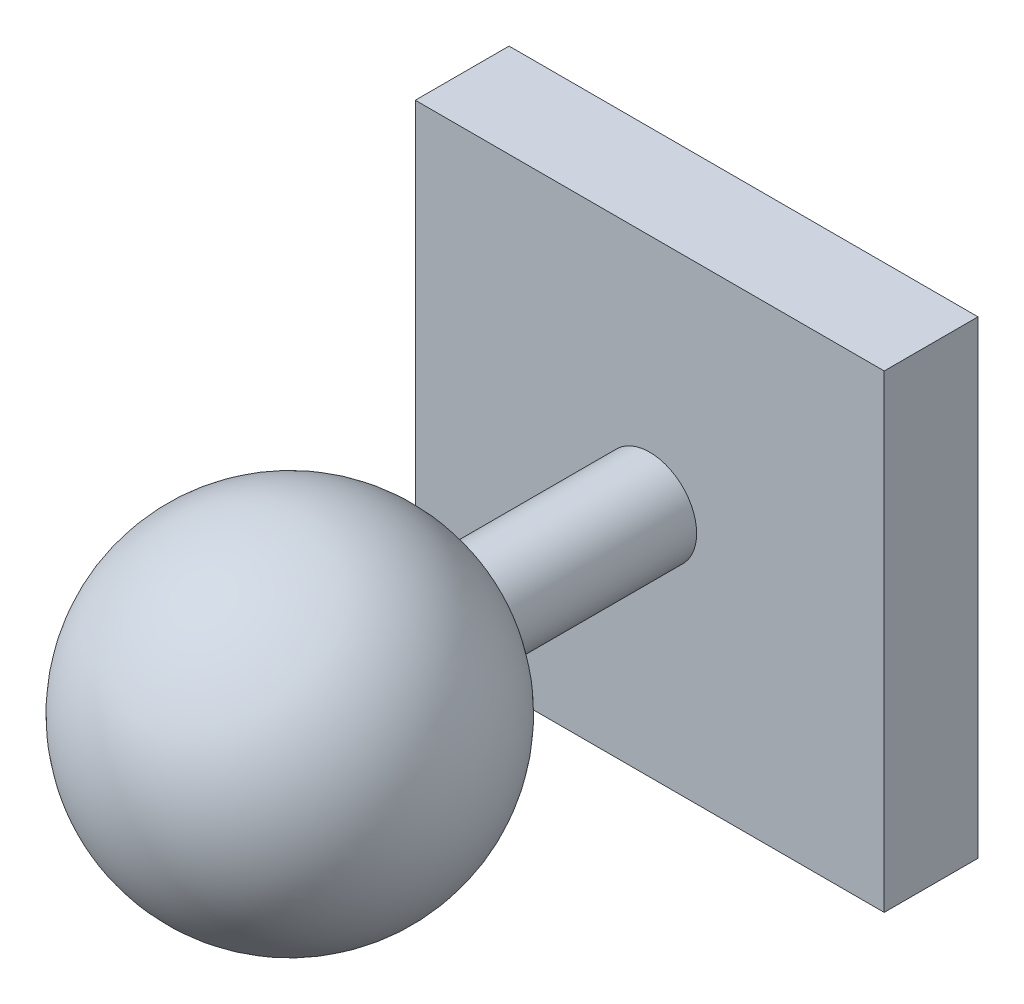
ISO-10303-21;
HEADER;
FILE_DESCRIPTION(('STEP AP214'),'2;1');
FILE_NAME('part.step','',(''),(''),'','','');
FILE_SCHEMA(('AUTOMOTIVE_DESIGN { 1 0 10303 214 1 1 1 1 }'));
ENDSEC;
DATA;
#1=APPLICATION_CONTEXT('core data for automotive mechanical design processes');
#2=APPLICATION_PROTOCOL_DEFINITION('international standard','automotive_design',2000,#1);
#3=PRODUCT_CONTEXT('',#1,'mechanical');
#4=PRODUCT('Part','Part','',(#3));
#5=PRODUCT_RELATED_PRODUCT_CATEGORY('part','',(#4));
#6=PRODUCT_DEFINITION_FORMATION('','',#4);
#7=PRODUCT_DEFINITION_CONTEXT('part definition',#1,'design');
#8=PRODUCT_DEFINITION('design','',#6,#7);
#9=PRODUCT_DEFINITION_SHAPE('','',#8);
#10=(LENGTH_UNIT() NAMED_UNIT(*) SI_UNIT(.MILLI.,.METRE.));
#11=(NAMED_UNIT(*) PLANE_ANGLE_UNIT() SI_UNIT($,.RADIAN.));
#12=(NAMED_UNIT(*) SI_UNIT($,.STERADIAN.) SOLID_ANGLE_UNIT());
#13=UNCERTAINTY_MEASURE_WITH_UNIT(LENGTH_MEASURE(1.E-05),#10,'distance_accuracy_value','');
#14=(GEOMETRIC_REPRESENTATION_CONTEXT(3) GLOBAL_UNCERTAINTY_ASSIGNED_CONTEXT((#13)) GLOBAL_UNIT_ASSIGNED_CONTEXT((#10,
#11,#12)) REPRESENTATION_CONTEXT('',''));
#15=CARTESIAN_POINT('',(0.,0.,0.));
#16=DIRECTION('',(0.,0.,1.));
#17=DIRECTION('',(1.,0.,0.));
#18=AXIS2_PLACEMENT_3D('',#15,#16,#17);
#19=CARTESIAN_POINT('',(0.,0.,48.3830677839276));
#20=DIRECTION('',(0.,0.,-1.));
#21=DIRECTION('',(-1.,0.,0.));
#22=AXIS2_PLACEMENT_3D('',#19,#20,#21);
#23=SPHERICAL_SURFACE('',#22,18.3830677839276);
#24=CARTESIAN_POINT('',(0.,0.,30.));
#25=VERTEX_POINT('',#24);
#26=VERTEX_LOOP('',#25);
#27=FACE_BOUND('',#26,.T.);
#28=ADVANCED_FACE('F38',(#27),#23,.T.);
#29=CLOSED_SHELL('',(#28));
#30=MANIFOLD_SOLID_BREP('B2',#29);
#31=CARTESIAN_POINT('',(-25.,25.,10.));
#32=DIRECTION('',(0.,0.,1.));
#33=DIRECTION('',(1.,0.,0.));
#34=AXIS2_PLACEMENT_3D('',#31,#32,#33);
#35=PLANE('',#34);
#36=DIRECTION('',(0.,-1.,0.));
#37=VECTOR('',#36,1.);
#38=CARTESIAN_POINT('',(-25.,-25.,10.));
#39=LINE('',#38,#37);
#40=CARTESIAN_POINT('',(-25.,25.,10.));
#41=VERTEX_POINT('',#40);
#42=CARTESIAN_POINT('',(-25.,-25.,10.));
#43=VERTEX_POINT('',#42);
#44=EDGE_CURVE('E102',#41,#43,#39,.T.);
#45=ORIENTED_EDGE('',*,*,#44,.T.);
#46=DIRECTION('',(1.,0.,0.));
#47=VECTOR('',#46,1.);
#48=CARTESIAN_POINT('',(25.,-25.,10.));
#49=LINE('',#48,#47);
#50=CARTESIAN_POINT('',(25.,-25.,10.));
#51=VERTEX_POINT('',#50);
#52=EDGE_CURVE('E97',#43,#51,#49,.T.);
#53=ORIENTED_EDGE('',*,*,#52,.T.);
#54=DIRECTION('',(0.,1.,0.));
#55=VECTOR('',#54,1.);
#56=CARTESIAN_POINT('',(25.,-25.,10.));
#57=LINE('',#56,#55);
#58=CARTESIAN_POINT('',(25.,25.,10.));
#59=VERTEX_POINT('',#58);
#60=EDGE_CURVE('E100',#51,#59,#57,.T.);
#61=ORIENTED_EDGE('',*,*,#60,.T.);
#62=DIRECTION('',(-1.,0.,0.));
#63=VECTOR('',#62,1.);
#64=CARTESIAN_POINT('',(25.,25.,10.));
#65=LINE('',#64,#63);
#66=EDGE_CURVE('E67',#59,#41,#65,.T.);
#67=ORIENTED_EDGE('',*,*,#66,.T.);
#68=EDGE_LOOP('',(#45,#53,#61,#67));
#69=FACE_BOUND('',#68,.T.);
#70=CARTESIAN_POINT('',(0.,0.,10.));
#71=DIRECTION('',(0.,0.,1.));
#72=DIRECTION('',(1.,0.,0.));
#73=AXIS2_PLACEMENT_3D('',#70,#71,#72);
#74=CIRCLE('',#73,5.);
#75=CARTESIAN_POINT('',(5.,0.,10.));
#76=VERTEX_POINT('',#75);
#77=EDGE_CURVE('E128',#76,#76,#74,.T.);
#78=ORIENTED_EDGE('',*,*,#77,.F.);
#79=EDGE_LOOP('',(#78));
#80=FACE_BOUND('',#79,.T.);
#81=ADVANCED_FACE('F50',(#69,#80),#35,.T.);
#82=CARTESIAN_POINT('',(-25.,-25.,10.));
#83=DIRECTION('',(1.,0.,0.));
#84=DIRECTION('',(0.,0.,-1.));
#85=AXIS2_PLACEMENT_3D('',#82,#83,#84);
#86=PLANE('',#85);
#87=DIRECTION('',(0.,-1.,0.));
#88=VECTOR('',#87,1.);
#89=CARTESIAN_POINT('',(-25.,-25.,0.));
#90=LINE('',#89,#88);
#91=CARTESIAN_POINT('',(-25.,25.,0.));
#92=VERTEX_POINT('',#91);
#93=CARTESIAN_POINT('',(-25.,-25.,0.));
#94=VERTEX_POINT('',#93);
#95=EDGE_CURVE('E114',#92,#94,#90,.T.);
#96=ORIENTED_EDGE('',*,*,#95,.T.);
#97=DIRECTION('',(0.,0.,-1.));
#98=VECTOR('',#97,1.);
#99=CARTESIAN_POINT('',(-25.,-25.,10.));
#100=LINE('',#99,#98);
#101=EDGE_CURVE('E36',#43,#94,#100,.T.);
#102=ORIENTED_EDGE('',*,*,#101,.F.);
#103=ORIENTED_EDGE('',*,*,#44,.F.);
#104=DIRECTION('',(0.,0.,-1.));
#105=VECTOR('',#104,1.);
#106=CARTESIAN_POINT('',(-25.,25.,10.));
#107=LINE('',#106,#105);
#108=EDGE_CURVE('E110',#41,#92,#107,.T.);
#109=ORIENTED_EDGE('',*,*,#108,.T.);
#110=EDGE_LOOP('',(#96,#102,#103,#109));
#111=FACE_BOUND('',#110,.T.);
#112=ADVANCED_FACE('F52',(#111),#86,.F.);
#113=CARTESIAN_POINT('',(25.,-25.,10.));
#114=DIRECTION('',(0.,1.,0.));
#115=DIRECTION('',(-1.,0.,0.));
#116=AXIS2_PLACEMENT_3D('',#113,#114,#115);
#117=PLANE('',#116);
#118=DIRECTION('',(1.,0.,0.));
#119=VECTOR('',#118,1.);
#120=CARTESIAN_POINT('',(25.,-25.,0.));
#121=LINE('',#120,#119);
#122=CARTESIAN_POINT('',(25.,-25.,0.));
#123=VERTEX_POINT('',#122);
#124=EDGE_CURVE('E106',#94,#123,#121,.T.);
#125=ORIENTED_EDGE('',*,*,#124,.T.);
#126=DIRECTION('',(0.,0.,-1.));
#127=VECTOR('',#126,1.);
#128=CARTESIAN_POINT('',(25.,-25.,10.));
#129=LINE('',#128,#127);
#130=EDGE_CURVE('E59',#51,#123,#129,.T.);
#131=ORIENTED_EDGE('',*,*,#130,.F.);
#132=ORIENTED_EDGE('',*,*,#52,.F.);
#133=ORIENTED_EDGE('',*,*,#101,.T.);
#134=EDGE_LOOP('',(#125,#131,#132,#133));
#135=FACE_BOUND('',#134,.T.);
#136=ADVANCED_FACE('F105',(#135),#117,.F.);
#137=CARTESIAN_POINT('',(25.,-25.,10.));
#138=DIRECTION('',(-1.,0.,0.));
#139=DIRECTION('',(0.,0.,1.));
#140=AXIS2_PLACEMENT_3D('',#137,#138,#139);
#141=PLANE('',#140);
#142=DIRECTION('',(0.,1.,0.));
#143=VECTOR('',#142,1.);
#144=CARTESIAN_POINT('',(25.,-25.,0.));
#145=LINE('',#144,#143);
#146=CARTESIAN_POINT('',(25.,25.,0.));
#147=VERTEX_POINT('',#146);
#148=EDGE_CURVE('E84',#123,#147,#145,.T.);
#149=ORIENTED_EDGE('',*,*,#148,.T.);
#150=DIRECTION('',(0.,0.,-1.));
#151=VECTOR('',#150,1.);
#152=CARTESIAN_POINT('',(25.,25.,10.));
#153=LINE('',#152,#151);
#154=EDGE_CURVE('E107',#59,#147,#153,.T.);
#155=ORIENTED_EDGE('',*,*,#154,.F.);
#156=ORIENTED_EDGE('',*,*,#60,.F.);
#157=ORIENTED_EDGE('',*,*,#130,.T.);
#158=EDGE_LOOP('',(#149,#155,#156,#157));
#159=FACE_BOUND('',#158,.T.);
#160=ADVANCED_FACE('F108',(#159),#141,.F.);
#161=CARTESIAN_POINT('',(25.,25.,10.));
#162=DIRECTION('',(0.,-1.,0.));
#163=DIRECTION('',(1.,0.,0.));
#164=AXIS2_PLACEMENT_3D('',#161,#162,#163);
#165=PLANE('',#164);
#166=DIRECTION('',(-1.,0.,0.));
#167=VECTOR('',#166,1.);
#168=CARTESIAN_POINT('',(25.,25.,0.));
#169=LINE('',#168,#167);
#170=EDGE_CURVE('E90',#147,#92,#169,.T.);
#171=ORIENTED_EDGE('',*,*,#170,.T.);
#172=ORIENTED_EDGE('',*,*,#108,.F.);
#173=ORIENTED_EDGE('',*,*,#66,.F.);
#174=ORIENTED_EDGE('',*,*,#154,.T.);
#175=EDGE_LOOP('',(#171,#172,#173,#174));
#176=FACE_BOUND('',#175,.T.);
#177=ADVANCED_FACE('F122',(#176),#165,.F.);
#178=CARTESIAN_POINT('',(-25.,25.,0.));
#179=DIRECTION('',(0.,0.,1.));
#180=DIRECTION('',(1.,0.,0.));
#181=AXIS2_PLACEMENT_3D('',#178,#179,#180);
#182=PLANE('',#181);
#183=CARTESIAN_POINT('',(0.,0.,0.));
#184=DIRECTION('',(0.,0.,-1.));
#185=DIRECTION('',(-1.,0.,0.));
#186=AXIS2_PLACEMENT_3D('',#183,#184,#185);
#187=CIRCLE('',#186,5.);
#188=CARTESIAN_POINT('',(-5.,0.,0.));
#189=VERTEX_POINT('',#188);
#190=EDGE_CURVE('E134',#189,#189,#187,.T.);
#191=ORIENTED_EDGE('',*,*,#190,.F.);
#192=EDGE_LOOP('',(#191));
#193=FACE_BOUND('',#192,.T.);
#194=ORIENTED_EDGE('',*,*,#95,.F.);
#195=ORIENTED_EDGE('',*,*,#170,.F.);
#196=ORIENTED_EDGE('',*,*,#148,.F.);
#197=ORIENTED_EDGE('',*,*,#124,.F.);
#198=EDGE_LOOP('',(#194,#195,#196,#197));
#199=FACE_BOUND('',#198,.T.);
#200=ADVANCED_FACE('F125',(#193,#199),#182,.F.);
#201=CARTESIAN_POINT('',(0.,0.,30.));
#202=DIRECTION('',(0.,0.,-1.));
#203=DIRECTION('',(-1.,0.,0.));
#204=AXIS2_PLACEMENT_3D('',#201,#202,#203);
#205=CYLINDRICAL_SURFACE('',#204,5.);
#206=CARTESIAN_POINT('',(0.,0.,30.));
#207=DIRECTION('',(0.,0.,1.));
#208=DIRECTION('',(1.,0.,0.));
#209=AXIS2_PLACEMENT_3D('',#206,#207,#208);
#210=CIRCLE('',#209,5.);
#211=CARTESIAN_POINT('',(5.,0.,30.));
#212=VERTEX_POINT('',#211);
#213=EDGE_CURVE('E117',#212,#212,#210,.T.);
#214=ORIENTED_EDGE('',*,*,#213,.F.);
#215=EDGE_LOOP('',(#214));
#216=FACE_BOUND('',#215,.T.);
#217=ORIENTED_EDGE('',*,*,#77,.T.);
#218=EDGE_LOOP('',(#217));
#219=FACE_BOUND('',#218,.T.);
#220=ADVANCED_FACE('F150',(#216,#219),#205,.T.);
#221=CARTESIAN_POINT('',(0.,0.,30.));
#222=DIRECTION('',(0.,0.,1.));
#223=DIRECTION('',(1.,0.,0.));
#224=AXIS2_PLACEMENT_3D('',#221,#222,#223);
#225=PLANE('',#224);
#226=ORIENTED_EDGE('',*,*,#213,.T.);
#227=EDGE_LOOP('',(#226));
#228=FACE_BOUND('',#227,.T.);
#229=ADVANCED_FACE('F145',(#228),#225,.T.);
#230=CARTESIAN_POINT('',(0.,0.,5.));
#231=DIRECTION('',(0.,0.,-1.));
#232=DIRECTION('',(-1.,0.,0.));
#233=AXIS2_PLACEMENT_3D('',#230,#231,#232);
#234=CYLINDRICAL_SURFACE('',#233,5.);
#235=CARTESIAN_POINT('',(0.,0.,5.));
#236=DIRECTION('',(0.,0.,-1.));
#237=DIRECTION('',(-1.,0.,0.));
#238=AXIS2_PLACEMENT_3D('',#235,#236,#237);
#239=CIRCLE('',#238,5.);
#240=CARTESIAN_POINT('',(-5.,0.,5.));
#241=VERTEX_POINT('',#240);
#242=EDGE_CURVE('E131',#241,#241,#239,.T.);
#243=ORIENTED_EDGE('',*,*,#242,.F.);
#244=EDGE_LOOP('',(#243));
#245=FACE_BOUND('',#244,.T.);
#246=ORIENTED_EDGE('',*,*,#190,.T.);
#247=EDGE_LOOP('',(#246));
#248=FACE_BOUND('',#247,.T.);
#249=ADVANCED_FACE('F142',(#245,#248),#234,.F.);
#250=CARTESIAN_POINT('',(0.,0.,5.));
#251=DIRECTION('',(0.,0.,-1.));
#252=DIRECTION('',(-1.,0.,0.));
#253=AXIS2_PLACEMENT_3D('',#250,#251,#252);
#254=PLANE('',#253);
#255=ORIENTED_EDGE('',*,*,#242,.T.);
#256=EDGE_LOOP('',(#255));
#257=FACE_BOUND('',#256,.T.);
#258=ADVANCED_FACE('F140',(#257),#254,.T.);
#259=CLOSED_SHELL('',(#81,#112,#136,#160,#177,#200,#220,#229,#249,#258));
#260=MANIFOLD_SOLID_BREP('B6',#259);
#261=ADVANCED_BREP_SHAPE_REPRESENTATION('',(#18,#30,#260),#14);
#262=SHAPE_DEFINITION_REPRESENTATION(#9,#261);
ENDSEC;
END-ISO-10303-21;
